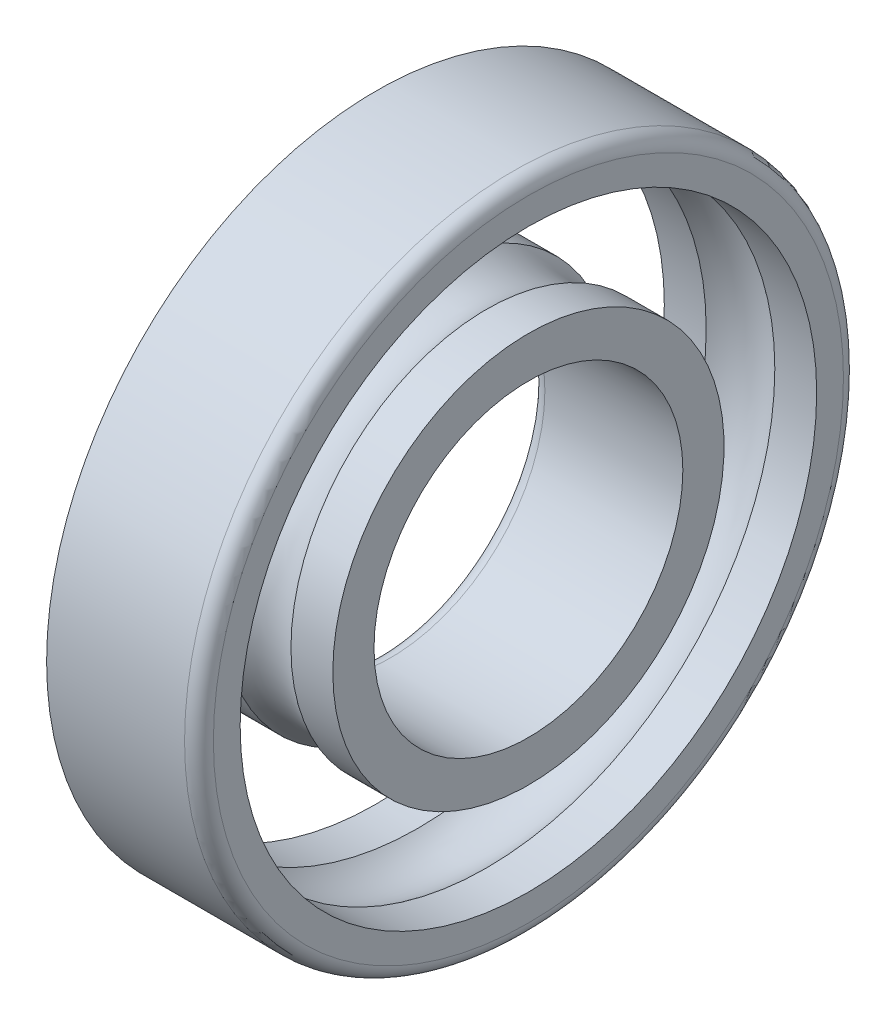
ISO-10303-21;
HEADER;
FILE_DESCRIPTION(('STEP AP214'),'2;1');
FILE_NAME('part.step','',(''),(''),'','','');
FILE_SCHEMA(('AUTOMOTIVE_DESIGN { 1 0 10303 214 1 1 1 1 }'));
ENDSEC;
DATA;
#1=APPLICATION_CONTEXT('core data for automotive mechanical design processes');
#2=APPLICATION_PROTOCOL_DEFINITION('international standard','automotive_design',2000,#1);
#3=PRODUCT_CONTEXT('',#1,'mechanical');
#4=PRODUCT('Part','Part','',(#3));
#5=PRODUCT_RELATED_PRODUCT_CATEGORY('part','',(#4));
#6=PRODUCT_DEFINITION_FORMATION('','',#4);
#7=PRODUCT_DEFINITION_CONTEXT('part definition',#1,'design');
#8=PRODUCT_DEFINITION('design','',#6,#7);
#9=PRODUCT_DEFINITION_SHAPE('','',#8);
#10=(LENGTH_UNIT() NAMED_UNIT(*) SI_UNIT(.MILLI.,.METRE.));
#11=(NAMED_UNIT(*) PLANE_ANGLE_UNIT() SI_UNIT($,.RADIAN.));
#12=(NAMED_UNIT(*) SI_UNIT($,.STERADIAN.) SOLID_ANGLE_UNIT());
#13=UNCERTAINTY_MEASURE_WITH_UNIT(LENGTH_MEASURE(1.E-05),#10,'distance_accuracy_value','');
#14=(GEOMETRIC_REPRESENTATION_CONTEXT(3) GLOBAL_UNCERTAINTY_ASSIGNED_CONTEXT((#13)) GLOBAL_UNIT_ASSIGNED_CONTEXT((#10,
#11,#12)) REPRESENTATION_CONTEXT('',''));
#15=CARTESIAN_POINT('',(0.,0.,0.));
#16=DIRECTION('',(0.,0.,1.));
#17=DIRECTION('',(1.,0.,0.));
#18=AXIS2_PLACEMENT_3D('',#15,#16,#17);
#19=CARTESIAN_POINT('',(-18.5,47.5,0.));
#20=DIRECTION('',(1.,0.,0.));
#21=DIRECTION('',(0.,0.,-1.));
#22=AXIS2_PLACEMENT_3D('',#19,#20,#21);
#23=PLANE('',#22);
#24=CARTESIAN_POINT('',(-18.5,0.,0.));
#25=DIRECTION('',(1.,0.,0.));
#26=DIRECTION('',(0.,0.,-1.));
#27=AXIS2_PLACEMENT_3D('',#24,#25,#26);
#28=CIRCLE('',#27,41.);
#29=CARTESIAN_POINT('',(-18.5,0.,-41.));
#30=VERTEX_POINT('',#29);
#31=EDGE_CURVE('E11',#30,#30,#28,.T.);
#32=ORIENTED_EDGE('',*,*,#31,.T.);
#33=EDGE_LOOP('',(#32));
#34=FACE_BOUND('',#33,.T.);
#35=CARTESIAN_POINT('',(-18.5,0.,0.));
#36=DIRECTION('',(-1.,0.,0.));
#37=DIRECTION('',(0.,0.,1.));
#38=AXIS2_PLACEMENT_3D('',#35,#36,#37);
#39=CIRCLE('',#38,47.5);
#40=CARTESIAN_POINT('',(-18.5,0.,47.5));
#41=VERTEX_POINT('',#40);
#42=EDGE_CURVE('E67',#41,#41,#39,.T.);
#43=ORIENTED_EDGE('',*,*,#42,.T.);
#44=EDGE_LOOP('',(#43));
#45=FACE_BOUND('',#44,.T.);
#46=ADVANCED_FACE('F42',(#34,#45),#23,.F.);
#47=CARTESIAN_POINT('',(-49.6592848525322,0.,0.));
#48=DIRECTION('',(-1.,0.,0.));
#49=DIRECTION('',(0.,0.,1.));
#50=AXIS2_PLACEMENT_3D('',#47,#48,#49);
#51=CYLINDRICAL_SURFACE('',#50,37.5);
#52=CARTESIAN_POINT('',(-15.,0.,0.));
#53=DIRECTION('',(1.,0.,0.));
#54=DIRECTION('',(0.,0.,-1.));
#55=AXIS2_PLACEMENT_3D('',#52,#53,#54);
#56=CIRCLE('',#55,37.5);
#57=CARTESIAN_POINT('',(-15.,0.,-37.5));
#58=VERTEX_POINT('',#57);
#59=EDGE_CURVE('E48',#58,#58,#56,.F.);
#60=ORIENTED_EDGE('',*,*,#59,.T.);
#61=EDGE_LOOP('',(#60));
#62=FACE_BOUND('',#61,.T.);
#63=CARTESIAN_POINT('',(18.5,0.,0.));
#64=DIRECTION('',(-1.,0.,0.));
#65=DIRECTION('',(0.,0.,1.));
#66=AXIS2_PLACEMENT_3D('',#63,#64,#65);
#67=CIRCLE('',#66,37.5);
#68=CARTESIAN_POINT('',(18.5,0.,37.5));
#69=VERTEX_POINT('',#68);
#70=EDGE_CURVE('E52',#69,#69,#67,.T.);
#71=ORIENTED_EDGE('',*,*,#70,.F.);
#72=EDGE_LOOP('',(#71));
#73=FACE_BOUND('',#72,.T.);
#74=ADVANCED_FACE('F94',(#62,#73),#51,.F.);
#75=CARTESIAN_POINT('',(18.5,47.5,0.));
#76=DIRECTION('',(-1.,0.,0.));
#77=DIRECTION('',(0.,0.,1.));
#78=AXIS2_PLACEMENT_3D('',#75,#76,#77);
#79=PLANE('',#78);
#80=CARTESIAN_POINT('',(18.5,0.,0.));
#81=DIRECTION('',(-1.,0.,0.));
#82=DIRECTION('',(0.,0.,1.));
#83=AXIS2_PLACEMENT_3D('',#80,#81,#82);
#84=CIRCLE('',#83,47.5);
#85=CARTESIAN_POINT('',(18.5,0.,47.5));
#86=VERTEX_POINT('',#85);
#87=EDGE_CURVE('E56',#86,#86,#84,.T.);
#88=ORIENTED_EDGE('',*,*,#87,.F.);
#89=EDGE_LOOP('',(#88));
#90=FACE_BOUND('',#89,.T.);
#91=ORIENTED_EDGE('',*,*,#70,.T.);
#92=EDGE_LOOP('',(#91));
#93=FACE_BOUND('',#92,.T.);
#94=ADVANCED_FACE('F88',(#90,#93),#79,.F.);
#95=CARTESIAN_POINT('',(-49.6592848525322,0.,0.));
#96=DIRECTION('',(-1.,0.,0.));
#97=DIRECTION('',(0.,0.,1.));
#98=AXIS2_PLACEMENT_3D('',#95,#96,#97);
#99=CYLINDRICAL_SURFACE('',#98,47.5);
#100=CARTESIAN_POINT('',(8.33291665624948,0.,0.));
#101=DIRECTION('',(-1.,0.,0.));
#102=DIRECTION('',(0.,0.,1.));
#103=AXIS2_PLACEMENT_3D('',#100,#101,#102);
#104=CIRCLE('',#103,47.5);
#105=CARTESIAN_POINT('',(8.33291665624948,0.,47.5));
#106=VERTEX_POINT('',#105);
#107=EDGE_CURVE('E61',#106,#106,#104,.T.);
#108=ORIENTED_EDGE('',*,*,#107,.F.);
#109=EDGE_LOOP('',(#108));
#110=FACE_BOUND('',#109,.T.);
#111=ORIENTED_EDGE('',*,*,#87,.T.);
#112=EDGE_LOOP('',(#111));
#113=FACE_BOUND('',#112,.T.);
#114=ADVANCED_FACE('F82',(#110,#113),#99,.T.);
#115=CARTESIAN_POINT('',(0.,0.,0.));
#116=DIRECTION('',(-1.,0.,0.));
#117=DIRECTION('',(0.,0.,1.));
#118=AXIS2_PLACEMENT_3D('',#115,#116,#117);
#119=TOROIDAL_SURFACE('',#118,58.75,14.);
#120=CARTESIAN_POINT('',(-8.33291665624948,0.,0.));
#121=DIRECTION('',(-1.,0.,0.));
#122=DIRECTION('',(0.,0.,1.));
#123=AXIS2_PLACEMENT_3D('',#120,#121,#122);
#124=CIRCLE('',#123,47.5);
#125=CARTESIAN_POINT('',(-8.33291665624948,0.,47.5));
#126=VERTEX_POINT('',#125);
#127=EDGE_CURVE('E64',#126,#126,#124,.T.);
#128=ORIENTED_EDGE('',*,*,#127,.F.);
#129=EDGE_LOOP('',(#128));
#130=FACE_BOUND('',#129,.T.);
#131=ORIENTED_EDGE('',*,*,#107,.T.);
#132=EDGE_LOOP('',(#131));
#133=FACE_BOUND('',#132,.T.);
#134=ADVANCED_FACE('F76',(#130,#133),#119,.F.);
#135=CARTESIAN_POINT('',(-49.6592848525322,0.,0.));
#136=DIRECTION('',(-1.,0.,0.));
#137=DIRECTION('',(0.,0.,1.));
#138=AXIS2_PLACEMENT_3D('',#135,#136,#137);
#139=CYLINDRICAL_SURFACE('',#138,47.5);
#140=ORIENTED_EDGE('',*,*,#42,.F.);
#141=EDGE_LOOP('',(#140));
#142=FACE_BOUND('',#141,.T.);
#143=ORIENTED_EDGE('',*,*,#127,.T.);
#144=EDGE_LOOP('',(#143));
#145=FACE_BOUND('',#144,.T.);
#146=ADVANCED_FACE('F72',(#142,#145),#139,.T.);
#147=CARTESIAN_POINT('',(-15.,0.,0.));
#148=DIRECTION('',(1.,0.,0.));
#149=DIRECTION('',(0.,0.,-1.));
#150=AXIS2_PLACEMENT_3D('',#147,#148,#149);
#151=TOROIDAL_SURFACE('',#150,41.,3.5);
#152=ORIENTED_EDGE('',*,*,#31,.F.);
#153=EDGE_LOOP('',(#152));
#154=FACE_BOUND('',#153,.T.);
#155=ORIENTED_EDGE('',*,*,#59,.F.);
#156=EDGE_LOOP('',(#155));
#157=FACE_BOUND('',#156,.T.);
#158=ADVANCED_FACE('F75',(#154,#157),#151,.T.);
#159=CLOSED_SHELL('',(#46,#74,#94,#114,#134,#146,#158));
#160=MANIFOLD_SOLID_BREP('B2',#159);
#161=CARTESIAN_POINT('',(-18.5,80.,0.));
#162=DIRECTION('',(1.,0.,0.));
#163=DIRECTION('',(0.,0.,-1.));
#164=AXIS2_PLACEMENT_3D('',#161,#162,#163);
#165=PLANE('',#164);
#166=CARTESIAN_POINT('',(-18.5,0.,0.));
#167=DIRECTION('',(-1.,0.,0.));
#168=DIRECTION('',(0.,0.,1.));
#169=AXIS2_PLACEMENT_3D('',#166,#167,#168);
#170=CIRCLE('',#169,70.);
#171=CARTESIAN_POINT('',(-18.5,0.,70.));
#172=VERTEX_POINT('',#171);
#173=EDGE_CURVE('E158',#172,#172,#170,.T.);
#174=ORIENTED_EDGE('',*,*,#173,.F.);
#175=EDGE_LOOP('',(#174));
#176=FACE_BOUND('',#175,.T.);
#177=CARTESIAN_POINT('',(-18.5,0.,0.));
#178=DIRECTION('',(-1.,0.,0.));
#179=DIRECTION('',(0.,0.,1.));
#180=AXIS2_PLACEMENT_3D('',#177,#178,#179);
#181=CIRCLE('',#180,80.);
#182=CARTESIAN_POINT('',(-18.5,0.,80.));
#183=VERTEX_POINT('',#182);
#184=EDGE_CURVE('E173',#183,#183,#181,.T.);
#185=ORIENTED_EDGE('',*,*,#184,.T.);
#186=EDGE_LOOP('',(#185));
#187=FACE_BOUND('',#186,.T.);
#188=ADVANCED_FACE('F148',(#176,#187),#165,.F.);
#189=CARTESIAN_POINT('',(-49.6592848525322,0.,0.));
#190=DIRECTION('',(-1.,0.,0.));
#191=DIRECTION('',(0.,0.,1.));
#192=AXIS2_PLACEMENT_3D('',#189,#190,#191);
#193=CYLINDRICAL_SURFACE('',#192,70.);
#194=CARTESIAN_POINT('',(-8.33291665624947,0.,0.));
#195=DIRECTION('',(-1.,0.,0.));
#196=DIRECTION('',(0.,0.,1.));
#197=AXIS2_PLACEMENT_3D('',#194,#195,#196);
#198=CIRCLE('',#197,70.);
#199=CARTESIAN_POINT('',(-8.33291665624947,0.,70.));
#200=VERTEX_POINT('',#199);
#201=EDGE_CURVE('E162',#200,#200,#198,.T.);
#202=ORIENTED_EDGE('',*,*,#201,.F.);
#203=EDGE_LOOP('',(#202));
#204=FACE_BOUND('',#203,.T.);
#205=ORIENTED_EDGE('',*,*,#173,.T.);
#206=EDGE_LOOP('',(#205));
#207=FACE_BOUND('',#206,.T.);
#208=ADVANCED_FACE('F192',(#204,#207),#193,.F.);
#209=CARTESIAN_POINT('',(0.,0.,0.));
#210=DIRECTION('',(-1.,0.,0.));
#211=DIRECTION('',(0.,0.,1.));
#212=AXIS2_PLACEMENT_3D('',#209,#210,#211);
#213=TOROIDAL_SURFACE('',#212,58.75,14.);
#214=CARTESIAN_POINT('',(8.33291665624947,0.,0.));
#215=DIRECTION('',(-1.,0.,0.));
#216=DIRECTION('',(0.,0.,1.));
#217=AXIS2_PLACEMENT_3D('',#214,#215,#216);
#218=CIRCLE('',#217,70.);
#219=CARTESIAN_POINT('',(8.33291665624947,0.,70.));
#220=VERTEX_POINT('',#219);
#221=EDGE_CURVE('E167',#220,#220,#218,.T.);
#222=ORIENTED_EDGE('',*,*,#221,.F.);
#223=EDGE_LOOP('',(#222));
#224=FACE_BOUND('',#223,.T.);
#225=ORIENTED_EDGE('',*,*,#201,.T.);
#226=EDGE_LOOP('',(#225));
#227=FACE_BOUND('',#226,.T.);
#228=ADVANCED_FACE('F197',(#224,#227),#213,.F.);
#229=CARTESIAN_POINT('',(-49.6592848525322,0.,0.));
#230=DIRECTION('',(-1.,0.,0.));
#231=DIRECTION('',(0.,0.,1.));
#232=AXIS2_PLACEMENT_3D('',#229,#230,#231);
#233=CYLINDRICAL_SURFACE('',#232,70.);
#234=CARTESIAN_POINT('',(18.5,0.,0.));
#235=DIRECTION('',(-1.,0.,0.));
#236=DIRECTION('',(0.,0.,1.));
#237=AXIS2_PLACEMENT_3D('',#234,#235,#236);
#238=CIRCLE('',#237,70.);
#239=CARTESIAN_POINT('',(18.5,0.,70.));
#240=VERTEX_POINT('',#239);
#241=EDGE_CURVE('E170',#240,#240,#238,.T.);
#242=ORIENTED_EDGE('',*,*,#241,.F.);
#243=EDGE_LOOP('',(#242));
#244=FACE_BOUND('',#243,.T.);
#245=ORIENTED_EDGE('',*,*,#221,.T.);
#246=EDGE_LOOP('',(#245));
#247=FACE_BOUND('',#246,.T.);
#248=ADVANCED_FACE('F189',(#244,#247),#233,.F.);
#249=CARTESIAN_POINT('',(18.5,80.,0.));
#250=DIRECTION('',(-1.,0.,0.));
#251=DIRECTION('',(0.,0.,1.));
#252=AXIS2_PLACEMENT_3D('',#249,#250,#251);
#253=PLANE('',#252);
#254=CARTESIAN_POINT('',(18.5,0.,0.));
#255=DIRECTION('',(-1.,0.,0.));
#256=DIRECTION('',(0.,0.,1.));
#257=AXIS2_PLACEMENT_3D('',#254,#255,#256);
#258=CIRCLE('',#257,76.5);
#259=CARTESIAN_POINT('',(18.5,0.,76.5));
#260=VERTEX_POINT('',#259);
#261=EDGE_CURVE('E41',#260,#260,#258,.F.);
#262=ORIENTED_EDGE('',*,*,#261,.T.);
#263=EDGE_LOOP('',(#262));
#264=FACE_BOUND('',#263,.T.);
#265=ORIENTED_EDGE('',*,*,#241,.T.);
#266=EDGE_LOOP('',(#265));
#267=FACE_BOUND('',#266,.T.);
#268=ADVANCED_FACE('F181',(#264,#267),#253,.F.);
#269=CARTESIAN_POINT('',(-49.6592848525322,0.,0.));
#270=DIRECTION('',(-1.,0.,0.));
#271=DIRECTION('',(0.,0.,1.));
#272=AXIS2_PLACEMENT_3D('',#269,#270,#271);
#273=CYLINDRICAL_SURFACE('',#272,80.);
#274=CARTESIAN_POINT('',(15.,0.,0.));
#275=DIRECTION('',(-1.,0.,0.));
#276=DIRECTION('',(0.,0.,1.));
#277=AXIS2_PLACEMENT_3D('',#274,#275,#276);
#278=CIRCLE('',#277,80.);
#279=CARTESIAN_POINT('',(15.,0.,80.));
#280=VERTEX_POINT('',#279);
#281=EDGE_CURVE('E154',#280,#280,#278,.T.);
#282=ORIENTED_EDGE('',*,*,#281,.T.);
#283=EDGE_LOOP('',(#282));
#284=FACE_BOUND('',#283,.T.);
#285=ORIENTED_EDGE('',*,*,#184,.F.);
#286=EDGE_LOOP('',(#285));
#287=FACE_BOUND('',#286,.T.);
#288=ADVANCED_FACE('F178',(#284,#287),#273,.T.);
#289=CARTESIAN_POINT('',(15.,0.,0.));
#290=DIRECTION('',(-1.,0.,0.));
#291=DIRECTION('',(0.,0.,1.));
#292=AXIS2_PLACEMENT_3D('',#289,#290,#291);
#293=TOROIDAL_SURFACE('',#292,76.5,3.5);
#294=ORIENTED_EDGE('',*,*,#261,.F.);
#295=EDGE_LOOP('',(#294));
#296=FACE_BOUND('',#295,.T.);
#297=ORIENTED_EDGE('',*,*,#281,.F.);
#298=EDGE_LOOP('',(#297));
#299=FACE_BOUND('',#298,.T.);
#300=ADVANCED_FACE('F180',(#296,#299),#293,.T.);
#301=CLOSED_SHELL('',(#188,#208,#228,#248,#268,#288,#300));
#302=MANIFOLD_SOLID_BREP('B6',#301);
#303=ADVANCED_BREP_SHAPE_REPRESENTATION('',(#18,#160,#302),#14);
#304=SHAPE_DEFINITION_REPRESENTATION(#9,#303);
ENDSEC;
END-ISO-10303-21;
